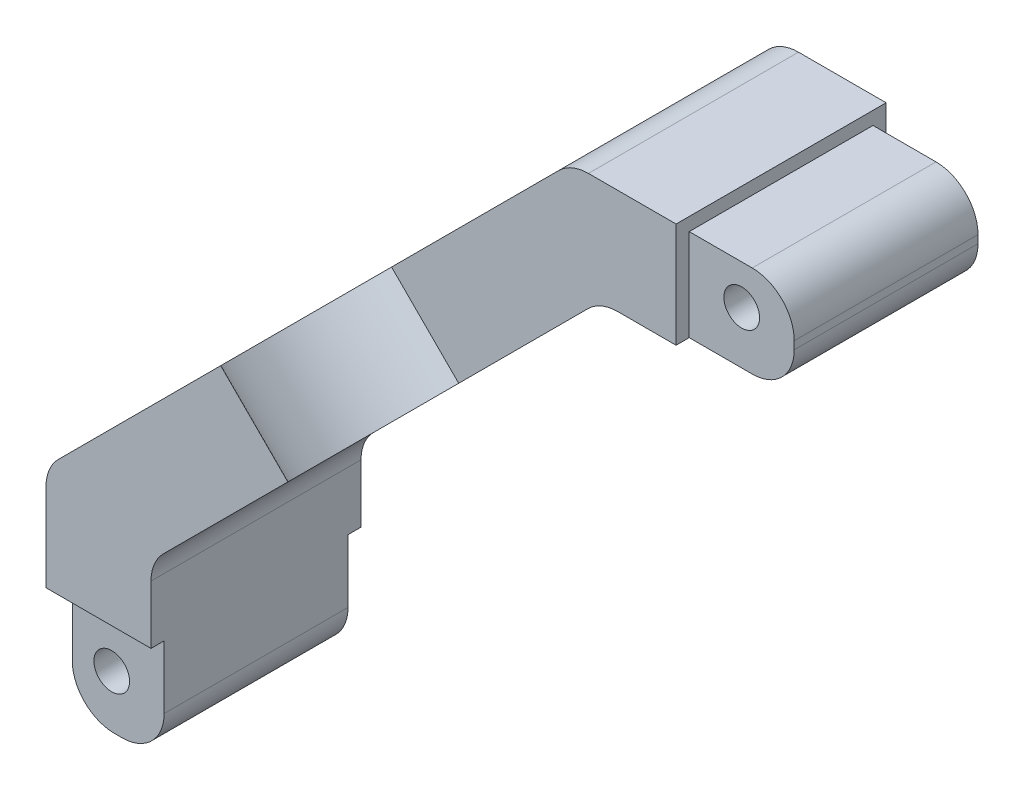
ISO-10303-21;
HEADER;
FILE_DESCRIPTION(('STEP AP214'),'2;1');
FILE_NAME('part.step','',(''),(''),'','','');
FILE_SCHEMA(('AUTOMOTIVE_DESIGN { 1 0 10303 214 1 1 1 1 }'));
ENDSEC;
DATA;
#1=APPLICATION_CONTEXT('core data for automotive mechanical design processes');
#2=APPLICATION_PROTOCOL_DEFINITION('international standard','automotive_design',2000,#1);
#3=PRODUCT_CONTEXT('',#1,'mechanical');
#4=PRODUCT('Part','Part','',(#3));
#5=PRODUCT_RELATED_PRODUCT_CATEGORY('part','',(#4));
#6=PRODUCT_DEFINITION_FORMATION('','',#4);
#7=PRODUCT_DEFINITION_CONTEXT('part definition',#1,'design');
#8=PRODUCT_DEFINITION('design','',#6,#7);
#9=PRODUCT_DEFINITION_SHAPE('','',#8);
#10=(LENGTH_UNIT() NAMED_UNIT(*) SI_UNIT(.MILLI.,.METRE.));
#11=(NAMED_UNIT(*) PLANE_ANGLE_UNIT() SI_UNIT($,.RADIAN.));
#12=(NAMED_UNIT(*) SI_UNIT($,.STERADIAN.) SOLID_ANGLE_UNIT());
#13=UNCERTAINTY_MEASURE_WITH_UNIT(LENGTH_MEASURE(1.E-05),#10,'distance_accuracy_value','');
#14=(GEOMETRIC_REPRESENTATION_CONTEXT(3) GLOBAL_UNCERTAINTY_ASSIGNED_CONTEXT((#13)) GLOBAL_UNIT_ASSIGNED_CONTEXT((#10,
#11,#12)) REPRESENTATION_CONTEXT('',''));
#15=CARTESIAN_POINT('',(0.,0.,0.));
#16=DIRECTION('',(0.,0.,1.));
#17=DIRECTION('',(1.,0.,0.));
#18=AXIS2_PLACEMENT_3D('',#15,#16,#17);
#19=CARTESIAN_POINT('',(39.8696158183963,-39.8696158183966,12.7));
#20=DIRECTION('',(-0.707106781186551,0.707106781186544,0.));
#21=DIRECTION('',(-0.707106781186544,-0.707106781186551,0.));
#22=AXIS2_PLACEMENT_3D('',#19,#20,#21);
#23=CYLINDRICAL_SURFACE('',#22,11.1125);
#24=CARTESIAN_POINT('',(39.1511953287108,-39.151195328711,12.7));
#25=DIRECTION('',(0.707106781186551,-0.707106781186544,0.));
#26=DIRECTION('',(0.707106781186544,0.707106781186551,0.));
#27=AXIS2_PLACEMENT_3D('',#24,#25,#26);
#28=CIRCLE('',#27,11.1125);
#29=CARTESIAN_POINT('',(47.0089194346463,-31.2934712227755,12.7));
#30=VERTEX_POINT('',#29);
#31=EDGE_CURVE('E12',#30,#30,#28,.T.);
#32=ORIENTED_EDGE('',*,*,#31,.T.);
#33=EDGE_LOOP('',(#32));
#34=FACE_BOUND('',#33,.T.);
#35=CARTESIAN_POINT('',(34.4440768363206,-34.4440768363209,12.7));
#36=DIRECTION('',(-0.707106781186548,0.707106781186547,0.));
#37=DIRECTION('',(-0.707106781186547,-0.707106781186548,0.));
#38=AXIS2_PLACEMENT_3D('',#35,#36,#37);
#39=CIRCLE('',#38,11.1125);
#40=CARTESIAN_POINT('',(26.5863527303851,-42.3018009422564,12.7));
#41=VERTEX_POINT('',#40);
#42=EDGE_CURVE('E438',#41,#41,#39,.F.);
#43=ORIENTED_EDGE('',*,*,#42,.F.);
#44=EDGE_LOOP('',(#43));
#45=FACE_BOUND('',#44,.T.);
#46=ADVANCED_FACE('F41',(#34,#45),#23,.F.);
#47=CARTESIAN_POINT('',(0.,0.,0.));
#48=DIRECTION('',(0.,0.,1.));
#49=DIRECTION('',(1.,0.,0.));
#50=AXIS2_PLACEMENT_3D('',#47,#48,#49);
#51=PLANE('',#50);
#52=DIRECTION('',(0.707106781186547,0.707106781186548,0.));
#53=VECTOR('',#52,1.);
#54=CARTESIAN_POINT('',(31.75,-31.75,0.));
#55=LINE('',#54,#53);
#56=CARTESIAN_POINT('',(41.7902315710345,-21.7097684289655,0.));
#57=VERTEX_POINT('',#56);
#58=CARTESIAN_POINT('',(62.0121024484277,-1.48789755157233,0.));
#59=VERTEX_POINT('',#58);
#60=EDGE_CURVE('E377',#57,#59,#55,.T.);
#61=ORIENTED_EDGE('',*,*,#60,.T.);
#62=CARTESIAN_POINT('',(65.6042048968553,-5.08,0.));
#63=DIRECTION('',(0.,0.,1.));
#64=DIRECTION('',(1.,0.,0.));
#65=AXIS2_PLACEMENT_3D('',#62,#63,#64);
#66=CIRCLE('',#65,5.08);
#67=CARTESIAN_POINT('',(65.6042048968553,0.,0.));
#68=VERTEX_POINT('',#67);
#69=EDGE_CURVE('E501',#59,#68,#66,.F.);
#70=ORIENTED_EDGE('',*,*,#69,.T.);
#71=DIRECTION('',(1.,0.,0.));
#72=VECTOR('',#71,1.);
#73=CARTESIAN_POINT('',(0.,0.,0.));
#74=LINE('',#73,#72);
#75=CARTESIAN_POINT('',(76.2,0.,0.));
#76=VERTEX_POINT('',#75);
#77=EDGE_CURVE('E428',#68,#76,#74,.T.);
#78=ORIENTED_EDGE('',*,*,#77,.T.);
#79=DIRECTION('',(0.,-1.,0.));
#80=VECTOR('',#79,1.);
#81=CARTESIAN_POINT('',(76.2,0.,0.));
#82=LINE('',#81,#80);
#83=CARTESIAN_POINT('',(76.2,-12.7,0.));
#84=VERTEX_POINT('',#83);
#85=EDGE_CURVE('E363',#76,#84,#82,.T.);
#86=ORIENTED_EDGE('',*,*,#85,.T.);
#87=DIRECTION('',(1.,0.,0.));
#88=VECTOR('',#87,1.);
#89=CARTESIAN_POINT('',(0.,-12.7,0.));
#90=LINE('',#89,#88);
#91=CARTESIAN_POINT('',(69.143436533648,-12.7,0.));
#92=VERTEX_POINT('',#91);
#93=EDGE_CURVE('E425',#92,#84,#90,.T.);
#94=ORIENTED_EDGE('',*,*,#93,.F.);
#95=CARTESIAN_POINT('',(69.143436533648,-17.78,0.));
#96=DIRECTION('',(0.,0.,1.));
#97=DIRECTION('',(1.,0.,0.));
#98=AXIS2_PLACEMENT_3D('',#95,#96,#97);
#99=CIRCLE('',#98,5.08);
#100=CARTESIAN_POINT('',(65.5513340852203,-14.1878975515724,0.));
#101=VERTEX_POINT('',#100);
#102=EDGE_CURVE('E531',#92,#101,#99,.T.);
#103=ORIENTED_EDGE('',*,*,#102,.T.);
#104=DIRECTION('',(-0.707106781186544,-0.707106781186551,0.));
#105=VECTOR('',#104,1.);
#106=CARTESIAN_POINT('',(39.8696158183966,-39.8696158183963,0.));
#107=LINE('',#106,#105);
#108=CARTESIAN_POINT('',(49.9098473894309,-29.8293842473619,0.));
#109=VERTEX_POINT('',#108);
#110=EDGE_CURVE('E422',#101,#109,#107,.T.);
#111=ORIENTED_EDGE('',*,*,#110,.T.);
#112=DIRECTION('',(-0.707106781186548,0.707106781186547,0.));
#113=VECTOR('',#112,1.);
#114=CARTESIAN_POINT('',(49.9098473894309,-29.829384247362,0.));
#115=LINE('',#114,#113);
#116=EDGE_CURVE('E277',#109,#57,#115,.T.);
#117=ORIENTED_EDGE('',*,*,#116,.T.);
#118=EDGE_LOOP('',(#61,#70,#78,#86,#94,#103,#111,#117));
#119=FACE_BOUND('',#118,.T.);
#120=ADVANCED_FACE('F556',(#119),#51,.F.);
#121=CARTESIAN_POINT('',(0.,0.,25.4));
#122=DIRECTION('',(0.,0.,1.));
#123=DIRECTION('',(1.,0.,0.));
#124=AXIS2_PLACEMENT_3D('',#121,#122,#123);
#125=PLANE('',#124);
#126=DIRECTION('',(1.,0.,0.));
#127=VECTOR('',#126,1.);
#128=CARTESIAN_POINT('',(0.,0.,25.4));
#129=LINE('',#128,#127);
#130=CARTESIAN_POINT('',(65.6042048968553,0.,25.4));
#131=VERTEX_POINT('',#130);
#132=CARTESIAN_POINT('',(76.2,0.,25.4));
#133=VERTEX_POINT('',#132);
#134=EDGE_CURVE('E408',#131,#133,#129,.T.);
#135=ORIENTED_EDGE('',*,*,#134,.F.);
#136=CARTESIAN_POINT('',(65.6042048968553,-5.08,25.4));
#137=DIRECTION('',(0.,0.,1.));
#138=DIRECTION('',(1.,0.,0.));
#139=AXIS2_PLACEMENT_3D('',#136,#137,#138);
#140=CIRCLE('',#139,5.08);
#141=CARTESIAN_POINT('',(62.0121024484277,-1.48789755157233,25.4));
#142=VERTEX_POINT('',#141);
#143=EDGE_CURVE('E507',#131,#142,#140,.T.);
#144=ORIENTED_EDGE('',*,*,#143,.T.);
#145=DIRECTION('',(0.707106781186547,0.707106781186548,0.));
#146=VECTOR('',#145,1.);
#147=CARTESIAN_POINT('',(31.75,-31.75,25.4));
#148=LINE('',#147,#146);
#149=CARTESIAN_POINT('',(41.7902315710345,-21.7097684289655,25.4));
#150=VERTEX_POINT('',#149);
#151=EDGE_CURVE('E399',#150,#142,#148,.T.);
#152=ORIENTED_EDGE('',*,*,#151,.F.);
#153=DIRECTION('',(-0.707106781186548,0.707106781186547,0.));
#154=VECTOR('',#153,1.);
#155=CARTESIAN_POINT('',(49.9098473894309,-29.829384247362,25.4));
#156=LINE('',#155,#154);
#157=CARTESIAN_POINT('',(49.9098473894309,-29.8293842473619,25.4));
#158=VERTEX_POINT('',#157);
#159=EDGE_CURVE('E253',#158,#150,#156,.T.);
#160=ORIENTED_EDGE('',*,*,#159,.F.);
#161=DIRECTION('',(-0.707106781186544,-0.707106781186551,0.));
#162=VECTOR('',#161,1.);
#163=CARTESIAN_POINT('',(39.8696158183966,-39.8696158183963,25.4));
#164=LINE('',#163,#162);
#165=CARTESIAN_POINT('',(65.5513340852203,-14.1878975515724,25.4));
#166=VERTEX_POINT('',#165);
#167=EDGE_CURVE('E242',#166,#158,#164,.T.);
#168=ORIENTED_EDGE('',*,*,#167,.F.);
#169=CARTESIAN_POINT('',(69.143436533648,-17.78,25.4));
#170=DIRECTION('',(0.,0.,1.));
#171=DIRECTION('',(1.,0.,0.));
#172=AXIS2_PLACEMENT_3D('',#169,#170,#171);
#173=CIRCLE('',#172,5.08);
#174=CARTESIAN_POINT('',(69.143436533648,-12.7,25.4));
#175=VERTEX_POINT('',#174);
#176=EDGE_CURVE('E534',#166,#175,#173,.F.);
#177=ORIENTED_EDGE('',*,*,#176,.T.);
#178=DIRECTION('',(1.,0.,0.));
#179=VECTOR('',#178,1.);
#180=CARTESIAN_POINT('',(0.,-12.7,25.4));
#181=LINE('',#180,#179);
#182=CARTESIAN_POINT('',(76.2,-12.7,25.4));
#183=VERTEX_POINT('',#182);
#184=EDGE_CURVE('E405',#175,#183,#181,.T.);
#185=ORIENTED_EDGE('',*,*,#184,.T.);
#186=DIRECTION('',(0.,-1.,0.));
#187=VECTOR('',#186,1.);
#188=CARTESIAN_POINT('',(76.2,0.,25.4));
#189=LINE('',#188,#187);
#190=EDGE_CURVE('E368',#133,#183,#189,.T.);
#191=ORIENTED_EDGE('',*,*,#190,.F.);
#192=EDGE_LOOP('',(#135,#144,#152,#160,#168,#177,#185,#191));
#193=FACE_BOUND('',#192,.T.);
#194=ADVANCED_FACE('F564',(#193),#125,.T.);
#195=DIRECTION('',(0.,-1.,0.));
#196=VECTOR('',#195,1.);
#197=CARTESIAN_POINT('',(0.,0.,0.));
#198=LINE('',#197,#196);
#199=CARTESIAN_POINT('',(0.,-65.6042048968553,0.));
#200=VERTEX_POINT('',#199);
#201=CARTESIAN_POINT('',(0.,-76.2,0.));
#202=VERTEX_POINT('',#201);
#203=EDGE_CURVE('E415',#200,#202,#198,.T.);
#204=ORIENTED_EDGE('',*,*,#203,.F.);
#205=CARTESIAN_POINT('',(5.08000000000001,-65.6042048968553,0.));
#206=DIRECTION('',(0.,0.,1.));
#207=DIRECTION('',(1.,0.,0.));
#208=AXIS2_PLACEMENT_3D('',#205,#206,#207);
#209=CIRCLE('',#208,5.08);
#210=CARTESIAN_POINT('',(1.48789755157234,-62.0121024484277,0.));
#211=VERTEX_POINT('',#210);
#212=EDGE_CURVE('E488',#200,#211,#209,.F.);
#213=ORIENTED_EDGE('',*,*,#212,.T.);
#214=CARTESIAN_POINT('',(21.7097684289653,-41.7902315710347,0.));
#215=VERTEX_POINT('',#214);
#216=EDGE_CURVE('E412',#211,#215,#55,.T.);
#217=ORIENTED_EDGE('',*,*,#216,.T.);
#218=DIRECTION('',(-0.707106781186548,0.707106781186547,0.));
#219=VECTOR('',#218,1.);
#220=CARTESIAN_POINT('',(29.8293842473617,-49.9098473894312,0.));
#221=LINE('',#220,#219);
#222=CARTESIAN_POINT('',(29.8293842473618,-49.9098473894312,0.));
#223=VERTEX_POINT('',#222);
#224=EDGE_CURVE('E273',#215,#223,#221,.F.);
#225=ORIENTED_EDGE('',*,*,#224,.T.);
#226=CARTESIAN_POINT('',(14.1878975515723,-65.5513340852208,0.));
#227=VERTEX_POINT('',#226);
#228=EDGE_CURVE('E421',#223,#227,#107,.T.);
#229=ORIENTED_EDGE('',*,*,#228,.T.);
#230=CARTESIAN_POINT('',(17.78,-69.1434365336484,0.));
#231=DIRECTION('',(0.,0.,1.));
#232=DIRECTION('',(1.,0.,0.));
#233=AXIS2_PLACEMENT_3D('',#230,#231,#232);
#234=CIRCLE('',#233,5.08);
#235=CARTESIAN_POINT('',(12.7,-69.1434365336484,0.));
#236=VERTEX_POINT('',#235);
#237=EDGE_CURVE('E537',#227,#236,#234,.T.);
#238=ORIENTED_EDGE('',*,*,#237,.T.);
#239=DIRECTION('',(0.,-1.,0.));
#240=VECTOR('',#239,1.);
#241=CARTESIAN_POINT('',(12.7,0.,0.));
#242=LINE('',#241,#240);
#243=CARTESIAN_POINT('',(12.7,-76.2,0.));
#244=VERTEX_POINT('',#243);
#245=EDGE_CURVE('E418',#236,#244,#242,.T.);
#246=ORIENTED_EDGE('',*,*,#245,.T.);
#247=DIRECTION('',(-1.,0.,0.));
#248=VECTOR('',#247,1.);
#249=CARTESIAN_POINT('',(0.,-76.2,0.));
#250=LINE('',#249,#248);
#251=EDGE_CURVE('E381',#244,#202,#250,.T.);
#252=ORIENTED_EDGE('',*,*,#251,.T.);
#253=EDGE_LOOP('',(#204,#213,#217,#225,#229,#238,#246,#252));
#254=FACE_BOUND('',#253,.T.);
#255=ADVANCED_FACE('F567',(#254),#51,.F.);
#256=CARTESIAN_POINT('',(31.75,-31.75,25.4));
#257=DIRECTION('',(-0.707106781186548,0.707106781186547,0.));
#258=DIRECTION('',(-0.707106781186547,-0.707106781186548,0.));
#259=AXIS2_PLACEMENT_3D('',#256,#257,#258);
#260=PLANE('',#259);
#261=ORIENTED_EDGE('',*,*,#216,.F.);
#262=DIRECTION('',(0.,0.,-1.));
#263=VECTOR('',#262,1.);
#264=CARTESIAN_POINT('',(1.48789755157234,-62.0121024484277,25.4));
#265=LINE('',#264,#263);
#266=CARTESIAN_POINT('',(1.48789755157234,-62.0121024484277,25.4));
#267=VERTEX_POINT('',#266);
#268=EDGE_CURVE('E495',#211,#267,#265,.F.);
#269=ORIENTED_EDGE('',*,*,#268,.T.);
#270=CARTESIAN_POINT('',(21.7097684289653,-41.7902315710347,25.4));
#271=VERTEX_POINT('',#270);
#272=EDGE_CURVE('E395',#267,#271,#148,.T.);
#273=ORIENTED_EDGE('',*,*,#272,.T.);
#274=CARTESIAN_POINT('',(31.7499999999999,-31.7500000000001,12.7));
#275=DIRECTION('',(-0.707106781186548,0.707106781186547,0.));
#276=DIRECTION('',(-0.707106781186547,-0.707106781186548,0.));
#277=AXIS2_PLACEMENT_3D('',#274,#275,#276);
#278=CIRCLE('',#277,19.05);
#279=EDGE_CURVE('E251',#150,#271,#278,.F.);
#280=ORIENTED_EDGE('',*,*,#279,.F.);
#281=ORIENTED_EDGE('',*,*,#151,.T.);
#282=DIRECTION('',(0.,0.,-1.));
#283=VECTOR('',#282,1.);
#284=CARTESIAN_POINT('',(62.0121024484277,-1.48789755157233,25.4));
#285=LINE('',#284,#283);
#286=EDGE_CURVE('E491',#142,#59,#285,.T.);
#287=ORIENTED_EDGE('',*,*,#286,.T.);
#288=ORIENTED_EDGE('',*,*,#60,.F.);
#289=EDGE_CURVE('E265',#215,#57,#278,.F.);
#290=ORIENTED_EDGE('',*,*,#289,.F.);
#291=EDGE_LOOP('',(#261,#269,#273,#280,#281,#287,#288,#290));
#292=FACE_BOUND('',#291,.T.);
#293=CARTESIAN_POINT('',(31.7499999999998,-31.7500000000002,12.7));
#294=DIRECTION('',(-0.707106781186548,0.707106781186547,0.));
#295=DIRECTION('',(-0.707106781186547,-0.707106781186548,0.));
#296=AXIS2_PLACEMENT_3D('',#293,#294,#295);
#297=CIRCLE('',#296,4.572);
#298=CARTESIAN_POINT('',(28.5171077964149,-34.982892203585,12.7));
#299=VERTEX_POINT('',#298);
#300=EDGE_CURVE('E269',#299,#299,#297,.T.);
#301=ORIENTED_EDGE('',*,*,#300,.F.);
#302=EDGE_LOOP('',(#301));
#303=FACE_BOUND('',#302,.T.);
#304=ADVANCED_FACE('F618',(#292,#303),#260,.T.);
#305=CARTESIAN_POINT('',(0.,0.,25.4));
#306=DIRECTION('',(1.,0.,0.));
#307=DIRECTION('',(0.,1.,0.));
#308=AXIS2_PLACEMENT_3D('',#305,#306,#307);
#309=PLANE('',#308);
#310=DIRECTION('',(0.,-1.,0.));
#311=VECTOR('',#310,1.);
#312=CARTESIAN_POINT('',(0.,0.,25.4));
#313=LINE('',#312,#311);
#314=CARTESIAN_POINT('',(0.,-65.6042048968553,25.4));
#315=VERTEX_POINT('',#314);
#316=CARTESIAN_POINT('',(0.,-76.2,25.4));
#317=VERTEX_POINT('',#316);
#318=EDGE_CURVE('E398',#315,#317,#313,.T.);
#319=ORIENTED_EDGE('',*,*,#318,.F.);
#320=DIRECTION('',(0.,0.,-1.));
#321=VECTOR('',#320,1.);
#322=CARTESIAN_POINT('',(0.,-65.6042048968553,0.));
#323=LINE('',#322,#321);
#324=EDGE_CURVE('E484',#315,#200,#323,.T.);
#325=ORIENTED_EDGE('',*,*,#324,.T.);
#326=ORIENTED_EDGE('',*,*,#203,.T.);
#327=DIRECTION('',(0.,0.,1.));
#328=VECTOR('',#327,1.);
#329=CARTESIAN_POINT('',(0.,-76.2,0.));
#330=LINE('',#329,#328);
#331=EDGE_CURVE('E372',#202,#317,#330,.T.);
#332=ORIENTED_EDGE('',*,*,#331,.T.);
#333=EDGE_LOOP('',(#319,#325,#326,#332));
#334=FACE_BOUND('',#333,.T.);
#335=ADVANCED_FACE('F639',(#334),#309,.F.);
#336=CARTESIAN_POINT('',(0.,-88.9,25.4));
#337=DIRECTION('',(0.,1.,0.));
#338=DIRECTION('',(-1.,0.,0.));
#339=AXIS2_PLACEMENT_3D('',#336,#337,#338);
#340=PLANE('',#339);
#341=DIRECTION('',(-1.,0.,0.));
#342=VECTOR('',#341,1.);
#343=CARTESIAN_POINT('',(12.7,-88.9,1.5748));
#344=LINE('',#343,#342);
#345=CARTESIAN_POINT('',(7.62000000000001,-88.9,1.5748));
#346=VERTEX_POINT('',#345);
#347=CARTESIAN_POINT('',(6.66750000000001,-88.9,1.5748));
#348=VERTEX_POINT('',#347);
#349=EDGE_CURVE('E324',#346,#348,#344,.T.);
#350=ORIENTED_EDGE('',*,*,#349,.F.);
#351=DIRECTION('',(0.,0.,-1.));
#352=VECTOR('',#351,1.);
#353=CARTESIAN_POINT('',(7.62000000000001,-88.9,23.8125));
#354=LINE('',#353,#352);
#355=CARTESIAN_POINT('',(7.62000000000001,-88.9,23.8125));
#356=VERTEX_POINT('',#355);
#357=EDGE_CURVE('E471',#346,#356,#354,.F.);
#358=ORIENTED_EDGE('',*,*,#357,.T.);
#359=DIRECTION('',(1.,0.,0.));
#360=VECTOR('',#359,1.);
#361=CARTESIAN_POINT('',(12.7,-88.9,23.8125));
#362=LINE('',#361,#360);
#363=CARTESIAN_POINT('',(6.66750000000001,-88.9,23.8125));
#364=VERTEX_POINT('',#363);
#365=EDGE_CURVE('E330',#364,#356,#362,.T.);
#366=ORIENTED_EDGE('',*,*,#365,.F.);
#367=DIRECTION('',(0.,0.,1.));
#368=VECTOR('',#367,1.);
#369=CARTESIAN_POINT('',(6.66750000000001,-88.9,25.4));
#370=LINE('',#369,#368);
#371=EDGE_CURVE('E468',#364,#348,#370,.F.);
#372=ORIENTED_EDGE('',*,*,#371,.T.);
#373=EDGE_LOOP('',(#350,#358,#366,#372));
#374=FACE_BOUND('',#373,.T.);
#375=ADVANCED_FACE('F635',(#374),#340,.F.);
#376=CARTESIAN_POINT('',(12.7,0.,25.4));
#377=DIRECTION('',(1.,0.,0.));
#378=DIRECTION('',(0.,1.,0.));
#379=AXIS2_PLACEMENT_3D('',#376,#377,#378);
#380=PLANE('',#379);
#381=ORIENTED_EDGE('',*,*,#245,.F.);
#382=DIRECTION('',(0.,0.,-1.));
#383=VECTOR('',#382,1.);
#384=CARTESIAN_POINT('',(12.7,-69.1434365336484,25.4));
#385=LINE('',#384,#383);
#386=CARTESIAN_POINT('',(12.7,-69.1434365336484,25.4));
#387=VERTEX_POINT('',#386);
#388=EDGE_CURVE('E459',#236,#387,#385,.F.);
#389=ORIENTED_EDGE('',*,*,#388,.T.);
#390=DIRECTION('',(0.,-1.,0.));
#391=VECTOR('',#390,1.);
#392=CARTESIAN_POINT('',(12.7,0.,25.4));
#393=LINE('',#392,#391);
#394=CARTESIAN_POINT('',(12.7,-76.2,25.4));
#395=VERTEX_POINT('',#394);
#396=EDGE_CURVE('E243',#387,#395,#393,.T.);
#397=ORIENTED_EDGE('',*,*,#396,.T.);
#398=DIRECTION('',(0.,0.,1.));
#399=VECTOR('',#398,1.);
#400=CARTESIAN_POINT('',(12.7,-76.2,25.4));
#401=LINE('',#400,#399);
#402=CARTESIAN_POINT('',(12.7,-76.2,23.8125));
#403=VERTEX_POINT('',#402);
#404=EDGE_CURVE('E325',#403,#395,#401,.T.);
#405=ORIENTED_EDGE('',*,*,#404,.F.);
#406=DIRECTION('',(0.,-1.,0.));
#407=VECTOR('',#406,1.);
#408=CARTESIAN_POINT('',(12.7,-76.2,23.8125));
#409=LINE('',#408,#407);
#410=CARTESIAN_POINT('',(12.7,-83.82,23.8125));
#411=VERTEX_POINT('',#410);
#412=EDGE_CURVE('E333',#403,#411,#409,.T.);
#413=ORIENTED_EDGE('',*,*,#412,.T.);
#414=DIRECTION('',(0.,0.,-1.));
#415=VECTOR('',#414,1.);
#416=CARTESIAN_POINT('',(12.7,-83.82,1.5748));
#417=LINE('',#416,#415);
#418=CARTESIAN_POINT('',(12.7,-83.82,1.5748));
#419=VERTEX_POINT('',#418);
#420=EDGE_CURVE('E455',#411,#419,#417,.T.);
#421=ORIENTED_EDGE('',*,*,#420,.T.);
#422=DIRECTION('',(0.,-1.,0.));
#423=VECTOR('',#422,1.);
#424=CARTESIAN_POINT('',(12.7,-76.2,1.5748));
#425=LINE('',#424,#423);
#426=CARTESIAN_POINT('',(12.7,-76.2,1.5748));
#427=VERTEX_POINT('',#426);
#428=EDGE_CURVE('E337',#427,#419,#425,.T.);
#429=ORIENTED_EDGE('',*,*,#428,.F.);
#430=DIRECTION('',(0.,0.,1.));
#431=VECTOR('',#430,1.);
#432=CARTESIAN_POINT('',(12.7,-76.2,0.));
#433=LINE('',#432,#431);
#434=EDGE_CURVE('E342',#244,#427,#433,.T.);
#435=ORIENTED_EDGE('',*,*,#434,.F.);
#436=EDGE_LOOP('',(#381,#389,#397,#405,#413,#421,#429,#435));
#437=FACE_BOUND('',#436,.T.);
#438=ADVANCED_FACE('F632',(#437),#380,.T.);
#439=CARTESIAN_POINT('',(39.8696158183966,-39.8696158183963,25.4));
#440=DIRECTION('',(0.707106781186551,-0.707106781186544,0.));
#441=DIRECTION('',(0.707106781186544,0.707106781186551,0.));
#442=AXIS2_PLACEMENT_3D('',#439,#440,#441);
#443=PLANE('',#442);
#444=CARTESIAN_POINT('',(39.8696158183963,-39.8696158183966,12.7));
#445=DIRECTION('',(0.707106781186551,-0.707106781186544,0.));
#446=DIRECTION('',(0.707106781186544,0.707106781186551,0.));
#447=AXIS2_PLACEMENT_3D('',#444,#445,#446);
#448=CIRCLE('',#447,12.1285);
#449=CARTESIAN_POINT('',(48.4457604140173,-31.2934712227755,12.7));
#450=VERTEX_POINT('',#449);
#451=EDGE_CURVE('E50',#450,#450,#448,.F.);
#452=ORIENTED_EDGE('',*,*,#451,.T.);
#453=EDGE_LOOP('',(#452));
#454=FACE_BOUND('',#453,.T.);
#455=ORIENTED_EDGE('',*,*,#110,.F.);
#456=DIRECTION('',(0.,0.,-1.));
#457=VECTOR('',#456,1.);
#458=CARTESIAN_POINT('',(65.5513340852203,-14.1878975515724,25.4));
#459=LINE('',#458,#457);
#460=EDGE_CURVE('E452',#101,#166,#459,.F.);
#461=ORIENTED_EDGE('',*,*,#460,.T.);
#462=ORIENTED_EDGE('',*,*,#167,.T.);
#463=CARTESIAN_POINT('',(39.8696158183963,-39.8696158183966,12.7));
#464=DIRECTION('',(-0.707106781186551,0.707106781186544,0.));
#465=DIRECTION('',(-0.707106781186544,-0.707106781186551,0.));
#466=AXIS2_PLACEMENT_3D('',#463,#464,#465);
#467=CIRCLE('',#466,19.05);
#468=CARTESIAN_POINT('',(29.8293842473618,-49.9098473894312,25.4));
#469=VERTEX_POINT('',#468);
#470=EDGE_CURVE('E249',#469,#158,#467,.T.);
#471=ORIENTED_EDGE('',*,*,#470,.F.);
#472=CARTESIAN_POINT('',(14.1878975515723,-65.5513340852208,25.4));
#473=VERTEX_POINT('',#472);
#474=EDGE_CURVE('E228',#469,#473,#164,.T.);
#475=ORIENTED_EDGE('',*,*,#474,.T.);
#476=DIRECTION('',(0.,0.,-1.));
#477=VECTOR('',#476,1.);
#478=CARTESIAN_POINT('',(14.1878975515723,-65.5513340852208,0.));
#479=LINE('',#478,#477);
#480=EDGE_CURVE('E449',#473,#227,#479,.T.);
#481=ORIENTED_EDGE('',*,*,#480,.T.);
#482=ORIENTED_EDGE('',*,*,#228,.F.);
#483=EDGE_CURVE('E261',#109,#223,#467,.T.);
#484=ORIENTED_EDGE('',*,*,#483,.F.);
#485=EDGE_LOOP('',(#455,#461,#462,#471,#475,#481,#482,#484));
#486=FACE_BOUND('',#485,.T.);
#487=ADVANCED_FACE('F257',(#454,#486),#443,.T.);
#488=CARTESIAN_POINT('',(0.,-12.7,25.4));
#489=DIRECTION('',(0.,1.,0.));
#490=DIRECTION('',(0.,0.,1.));
#491=AXIS2_PLACEMENT_3D('',#488,#489,#490);
#492=PLANE('',#491);
#493=ORIENTED_EDGE('',*,*,#184,.F.);
#494=DIRECTION('',(0.,0.,-1.));
#495=VECTOR('',#494,1.);
#496=CARTESIAN_POINT('',(69.143436533648,-12.7,25.4));
#497=LINE('',#496,#495);
#498=EDGE_CURVE('E445',#175,#92,#497,.T.);
#499=ORIENTED_EDGE('',*,*,#498,.T.);
#500=ORIENTED_EDGE('',*,*,#93,.T.);
#501=DIRECTION('',(0.,0.,-1.));
#502=VECTOR('',#501,1.);
#503=CARTESIAN_POINT('',(76.2,-12.7,0.));
#504=LINE('',#503,#502);
#505=CARTESIAN_POINT('',(76.2,-12.7,1.5875));
#506=VERTEX_POINT('',#505);
#507=EDGE_CURVE('E285',#506,#84,#504,.T.);
#508=ORIENTED_EDGE('',*,*,#507,.F.);
#509=DIRECTION('',(1.,0.,0.));
#510=VECTOR('',#509,1.);
#511=CARTESIAN_POINT('',(76.2,-12.7,1.5875));
#512=LINE('',#511,#510);
#513=CARTESIAN_POINT('',(83.82,-12.7,1.5875));
#514=VERTEX_POINT('',#513);
#515=EDGE_CURVE('E290',#506,#514,#512,.T.);
#516=ORIENTED_EDGE('',*,*,#515,.T.);
#517=DIRECTION('',(0.,0.,-1.));
#518=VECTOR('',#517,1.);
#519=CARTESIAN_POINT('',(83.82,-12.7,23.8125));
#520=LINE('',#519,#518);
#521=CARTESIAN_POINT('',(83.82,-12.7,23.8125));
#522=VERTEX_POINT('',#521);
#523=EDGE_CURVE('E442',#514,#522,#520,.F.);
#524=ORIENTED_EDGE('',*,*,#523,.T.);
#525=DIRECTION('',(1.,0.,0.));
#526=VECTOR('',#525,1.);
#527=CARTESIAN_POINT('',(76.2,-12.7,23.8125));
#528=LINE('',#527,#526);
#529=CARTESIAN_POINT('',(76.2,-12.7,23.8125));
#530=VERTEX_POINT('',#529);
#531=EDGE_CURVE('E294',#530,#522,#528,.T.);
#532=ORIENTED_EDGE('',*,*,#531,.F.);
#533=DIRECTION('',(0.,0.,-1.));
#534=VECTOR('',#533,1.);
#535=CARTESIAN_POINT('',(76.2,-12.7,25.4));
#536=LINE('',#535,#534);
#537=EDGE_CURVE('E299',#183,#530,#536,.T.);
#538=ORIENTED_EDGE('',*,*,#537,.F.);
#539=EDGE_LOOP('',(#493,#499,#500,#508,#516,#524,#532,#538));
#540=FACE_BOUND('',#539,.T.);
#541=ADVANCED_FACE('F626',(#540),#492,.F.);
#542=CARTESIAN_POINT('',(88.9,0.,25.4));
#543=DIRECTION('',(1.,0.,0.));
#544=DIRECTION('',(0.,0.,-1.));
#545=AXIS2_PLACEMENT_3D('',#542,#543,#544);
#546=PLANE('',#545);
#547=DIRECTION('',(0.,1.,0.));
#548=VECTOR('',#547,1.);
#549=CARTESIAN_POINT('',(88.9,-12.7,23.8125));
#550=LINE('',#549,#548);
#551=CARTESIAN_POINT('',(88.9,-7.62,23.8125));
#552=VERTEX_POINT('',#551);
#553=CARTESIAN_POINT('',(88.9,-6.6675,23.8125));
#554=VERTEX_POINT('',#553);
#555=EDGE_CURVE('E281',#552,#554,#550,.T.);
#556=ORIENTED_EDGE('',*,*,#555,.F.);
#557=DIRECTION('',(0.,0.,-1.));
#558=VECTOR('',#557,1.);
#559=CARTESIAN_POINT('',(88.9,-7.62,1.5875));
#560=LINE('',#559,#558);
#561=CARTESIAN_POINT('',(88.9,-7.62,1.5875));
#562=VERTEX_POINT('',#561);
#563=EDGE_CURVE('E514',#552,#562,#560,.T.);
#564=ORIENTED_EDGE('',*,*,#563,.T.);
#565=DIRECTION('',(0.,-1.,0.));
#566=VECTOR('',#565,1.);
#567=CARTESIAN_POINT('',(88.9,-12.7,1.5875));
#568=LINE('',#567,#566);
#569=CARTESIAN_POINT('',(88.9,-6.6675,1.5875));
#570=VERTEX_POINT('',#569);
#571=EDGE_CURVE('E286',#570,#562,#568,.T.);
#572=ORIENTED_EDGE('',*,*,#571,.F.);
#573=DIRECTION('',(0.,0.,1.));
#574=VECTOR('',#573,1.);
#575=CARTESIAN_POINT('',(88.9,-6.6675,23.8125));
#576=LINE('',#575,#574);
#577=EDGE_CURVE('E510',#570,#554,#576,.T.);
#578=ORIENTED_EDGE('',*,*,#577,.T.);
#579=EDGE_LOOP('',(#556,#564,#572,#578));
#580=FACE_BOUND('',#579,.T.);
#581=ADVANCED_FACE('F622',(#580),#546,.T.);
#582=CARTESIAN_POINT('',(0.,0.,25.4));
#583=DIRECTION('',(0.,1.,0.));
#584=DIRECTION('',(0.,0.,1.));
#585=AXIS2_PLACEMENT_3D('',#582,#583,#584);
#586=PLANE('',#585);
#587=ORIENTED_EDGE('',*,*,#77,.F.);
#588=DIRECTION('',(0.,0.,-1.));
#589=VECTOR('',#588,1.);
#590=CARTESIAN_POINT('',(65.6042048968553,0.,25.4));
#591=LINE('',#590,#589);
#592=EDGE_CURVE('E504',#68,#131,#591,.F.);
#593=ORIENTED_EDGE('',*,*,#592,.T.);
#594=ORIENTED_EDGE('',*,*,#134,.T.);
#595=DIRECTION('',(0.,0.,1.));
#596=VECTOR('',#595,1.);
#597=CARTESIAN_POINT('',(76.2,0.,0.));
#598=LINE('',#597,#596);
#599=EDGE_CURVE('E367',#76,#133,#598,.T.);
#600=ORIENTED_EDGE('',*,*,#599,.F.);
#601=EDGE_LOOP('',(#587,#593,#594,#600));
#602=FACE_BOUND('',#601,.T.);
#603=ADVANCED_FACE('F615',(#602),#586,.T.);
#604=ORIENTED_EDGE('',*,*,#272,.F.);
#605=CARTESIAN_POINT('',(5.08000000000001,-65.6042048968553,25.4));
#606=DIRECTION('',(0.,0.,1.));
#607=DIRECTION('',(1.,0.,0.));
#608=AXIS2_PLACEMENT_3D('',#605,#606,#607);
#609=CIRCLE('',#608,5.08);
#610=EDGE_CURVE('E498',#267,#315,#609,.T.);
#611=ORIENTED_EDGE('',*,*,#610,.T.);
#612=ORIENTED_EDGE('',*,*,#318,.T.);
#613=DIRECTION('',(-1.,0.,0.));
#614=VECTOR('',#613,1.);
#615=CARTESIAN_POINT('',(0.,-76.2,25.4));
#616=LINE('',#615,#614);
#617=EDGE_CURVE('E362',#395,#317,#616,.T.);
#618=ORIENTED_EDGE('',*,*,#617,.F.);
#619=ORIENTED_EDGE('',*,*,#396,.F.);
#620=CARTESIAN_POINT('',(17.78,-69.1434365336484,25.4));
#621=DIRECTION('',(0.,0.,1.));
#622=DIRECTION('',(1.,0.,0.));
#623=AXIS2_PLACEMENT_3D('',#620,#621,#622);
#624=CIRCLE('',#623,5.08);
#625=EDGE_CURVE('E236',#387,#473,#624,.F.);
#626=ORIENTED_EDGE('',*,*,#625,.T.);
#627=ORIENTED_EDGE('',*,*,#474,.F.);
#628=DIRECTION('',(-0.707106781186548,0.707106781186547,0.));
#629=VECTOR('',#628,1.);
#630=CARTESIAN_POINT('',(29.8293842473617,-49.9098473894312,25.4));
#631=LINE('',#630,#629);
#632=EDGE_CURVE('E232',#271,#469,#631,.F.);
#633=ORIENTED_EDGE('',*,*,#632,.F.);
#634=EDGE_LOOP('',(#604,#611,#612,#618,#619,#626,#627,#633));
#635=FACE_BOUND('',#634,.T.);
#636=ADVANCED_FACE('F231',(#635),#125,.T.);
#637=CARTESIAN_POINT('',(88.9,-1.5875,0.));
#638=DIRECTION('',(0.,-1.,0.));
#639=DIRECTION('',(1.,0.,0.));
#640=AXIS2_PLACEMENT_3D('',#637,#638,#639);
#641=PLANE('',#640);
#642=DIRECTION('',(1.,0.,0.));
#643=VECTOR('',#642,1.);
#644=CARTESIAN_POINT('',(88.9,-1.5875,23.8125));
#645=LINE('',#644,#643);
#646=CARTESIAN_POINT('',(76.2,-1.5875,23.8125));
#647=VERTEX_POINT('',#646);
#648=CARTESIAN_POINT('',(83.82,-1.5875,23.8125));
#649=VERTEX_POINT('',#648);
#650=EDGE_CURVE('E298',#647,#649,#645,.T.);
#651=ORIENTED_EDGE('',*,*,#650,.T.);
#652=DIRECTION('',(0.,0.,1.));
#653=VECTOR('',#652,1.);
#654=CARTESIAN_POINT('',(83.82,-1.5875,1.5875));
#655=LINE('',#654,#653);
#656=CARTESIAN_POINT('',(83.82,-1.5875,1.5875));
#657=VERTEX_POINT('',#656);
#658=EDGE_CURVE('E64',#649,#657,#655,.F.);
#659=ORIENTED_EDGE('',*,*,#658,.T.);
#660=DIRECTION('',(-1.,0.,0.));
#661=VECTOR('',#660,1.);
#662=CARTESIAN_POINT('',(88.9,-1.5875,1.5875));
#663=LINE('',#662,#661);
#664=CARTESIAN_POINT('',(76.2,-1.5875,1.5875));
#665=VERTEX_POINT('',#664);
#666=EDGE_CURVE('E317',#657,#665,#663,.T.);
#667=ORIENTED_EDGE('',*,*,#666,.T.);
#668=DIRECTION('',(0.,0.,1.));
#669=VECTOR('',#668,1.);
#670=CARTESIAN_POINT('',(76.2,-1.5875,0.));
#671=LINE('',#670,#669);
#672=EDGE_CURVE('E373',#665,#647,#671,.T.);
#673=ORIENTED_EDGE('',*,*,#672,.T.);
#674=EDGE_LOOP('',(#651,#659,#667,#673));
#675=FACE_BOUND('',#674,.T.);
#676=ADVANCED_FACE('F597',(#675),#641,.F.);
#677=CARTESIAN_POINT('',(76.2,0.,0.));
#678=DIRECTION('',(-1.,0.,0.));
#679=DIRECTION('',(0.,0.,1.));
#680=AXIS2_PLACEMENT_3D('',#677,#678,#679);
#681=PLANE('',#680);
#682=ORIENTED_EDGE('',*,*,#672,.F.);
#683=DIRECTION('',(0.,-1.,0.));
#684=VECTOR('',#683,1.);
#685=CARTESIAN_POINT('',(76.2,-12.7,1.5875));
#686=LINE('',#685,#684);
#687=EDGE_CURVE('E282',#665,#506,#686,.T.);
#688=ORIENTED_EDGE('',*,*,#687,.T.);
#689=ORIENTED_EDGE('',*,*,#507,.T.);
#690=ORIENTED_EDGE('',*,*,#85,.F.);
#691=ORIENTED_EDGE('',*,*,#599,.T.);
#692=ORIENTED_EDGE('',*,*,#190,.T.);
#693=ORIENTED_EDGE('',*,*,#537,.T.);
#694=DIRECTION('',(0.,1.,0.));
#695=VECTOR('',#694,1.);
#696=CARTESIAN_POINT('',(76.2,-12.7,23.8125));
#697=LINE('',#696,#695);
#698=EDGE_CURVE('E303',#530,#647,#697,.T.);
#699=ORIENTED_EDGE('',*,*,#698,.T.);
#700=EDGE_LOOP('',(#682,#688,#689,#690,#691,#692,#693,#699));
#701=FACE_BOUND('',#700,.T.);
#702=ADVANCED_FACE('F600',(#701),#681,.F.);
#703=CARTESIAN_POINT('',(0.,-76.2,0.));
#704=DIRECTION('',(0.,1.,0.));
#705=DIRECTION('',(0.,0.,1.));
#706=AXIS2_PLACEMENT_3D('',#703,#704,#705);
#707=PLANE('',#706);
#708=DIRECTION('',(0.,0.,1.));
#709=VECTOR('',#708,1.);
#710=CARTESIAN_POINT('',(1.58750000000001,-76.2,0.));
#711=LINE('',#710,#709);
#712=CARTESIAN_POINT('',(1.58750000000001,-76.2,1.5748));
#713=VERTEX_POINT('',#712);
#714=CARTESIAN_POINT('',(1.58750000000001,-76.2,23.8125));
#715=VERTEX_POINT('',#714);
#716=EDGE_CURVE('E385',#713,#715,#711,.T.);
#717=ORIENTED_EDGE('',*,*,#716,.T.);
#718=DIRECTION('',(1.,0.,0.));
#719=VECTOR('',#718,1.);
#720=CARTESIAN_POINT('',(12.7,-76.2,23.8125));
#721=LINE('',#720,#719);
#722=EDGE_CURVE('E329',#715,#403,#721,.T.);
#723=ORIENTED_EDGE('',*,*,#722,.T.);
#724=ORIENTED_EDGE('',*,*,#404,.T.);
#725=ORIENTED_EDGE('',*,*,#617,.T.);
#726=ORIENTED_EDGE('',*,*,#331,.F.);
#727=ORIENTED_EDGE('',*,*,#251,.F.);
#728=ORIENTED_EDGE('',*,*,#434,.T.);
#729=DIRECTION('',(-1.,0.,0.));
#730=VECTOR('',#729,1.);
#731=CARTESIAN_POINT('',(12.7,-76.2,1.5748));
#732=LINE('',#731,#730);
#733=EDGE_CURVE('E346',#427,#713,#732,.T.);
#734=ORIENTED_EDGE('',*,*,#733,.T.);
#735=EDGE_LOOP('',(#717,#723,#724,#725,#726,#727,#728,#734));
#736=FACE_BOUND('',#735,.T.);
#737=ADVANCED_FACE('F603',(#736),#707,.F.);
#738=CARTESIAN_POINT('',(1.58750000000001,-88.9,0.));
#739=DIRECTION('',(1.,0.,0.));
#740=DIRECTION('',(0.,0.,-1.));
#741=AXIS2_PLACEMENT_3D('',#738,#739,#740);
#742=PLANE('',#741);
#743=DIRECTION('',(0.,-1.,0.));
#744=VECTOR('',#743,1.);
#745=CARTESIAN_POINT('',(1.58750000000001,-88.9,1.5748));
#746=LINE('',#745,#744);
#747=CARTESIAN_POINT('',(1.58750000000001,-83.82,1.5748));
#748=VERTEX_POINT('',#747);
#749=EDGE_CURVE('E411',#713,#748,#746,.T.);
#750=ORIENTED_EDGE('',*,*,#749,.T.);
#751=DIRECTION('',(0.,0.,1.));
#752=VECTOR('',#751,1.);
#753=CARTESIAN_POINT('',(1.58750000000001,-83.82,0.));
#754=LINE('',#753,#752);
#755=CARTESIAN_POINT('',(1.58750000000001,-83.82,23.8125));
#756=VERTEX_POINT('',#755);
#757=EDGE_CURVE('E480',#748,#756,#754,.T.);
#758=ORIENTED_EDGE('',*,*,#757,.T.);
#759=DIRECTION('',(0.,1.,0.));
#760=VECTOR('',#759,1.);
#761=CARTESIAN_POINT('',(1.58750000000001,-88.9,23.8125));
#762=LINE('',#761,#760);
#763=EDGE_CURVE('E254',#756,#715,#762,.T.);
#764=ORIENTED_EDGE('',*,*,#763,.T.);
#765=ORIENTED_EDGE('',*,*,#716,.F.);
#766=EDGE_LOOP('',(#750,#758,#764,#765));
#767=FACE_BOUND('',#766,.T.);
#768=ADVANCED_FACE('F592',(#767),#742,.F.);
#769=CARTESIAN_POINT('',(12.7,-76.2,1.5748));
#770=DIRECTION('',(0.,0.,1.));
#771=DIRECTION('',(1.,0.,0.));
#772=AXIS2_PLACEMENT_3D('',#769,#770,#771);
#773=PLANE('',#772);
#774=ORIENTED_EDGE('',*,*,#428,.T.);
#775=CARTESIAN_POINT('',(7.62000000000001,-83.82,1.5748));
#776=DIRECTION('',(0.,0.,1.));
#777=DIRECTION('',(1.,0.,0.));
#778=AXIS2_PLACEMENT_3D('',#775,#776,#777);
#779=CIRCLE('',#778,5.08);
#780=EDGE_CURVE('E465',#419,#346,#779,.F.);
#781=ORIENTED_EDGE('',*,*,#780,.T.);
#782=ORIENTED_EDGE('',*,*,#349,.T.);
#783=CARTESIAN_POINT('',(6.66750000000001,-83.82,1.5748));
#784=DIRECTION('',(0.,0.,1.));
#785=DIRECTION('',(1.,0.,0.));
#786=AXIS2_PLACEMENT_3D('',#783,#784,#785);
#787=CIRCLE('',#786,5.08);
#788=EDGE_CURVE('E462',#348,#748,#787,.F.);
#789=ORIENTED_EDGE('',*,*,#788,.T.);
#790=ORIENTED_EDGE('',*,*,#749,.F.);
#791=ORIENTED_EDGE('',*,*,#733,.F.);
#792=EDGE_LOOP('',(#774,#781,#782,#789,#790,#791));
#793=FACE_BOUND('',#792,.T.);
#794=CARTESIAN_POINT('',(6.36270000000001,-82.55,1.5748));
#795=DIRECTION('',(0.,0.,1.));
#796=DIRECTION('',(1.,0.,0.));
#797=AXIS2_PLACEMENT_3D('',#794,#795,#796);
#798=CIRCLE('',#797,2.159);
#799=CARTESIAN_POINT('',(8.52170000000001,-82.55,1.5748));
#800=VERTEX_POINT('',#799);
#801=EDGE_CURVE('E341',#800,#800,#798,.F.);
#802=ORIENTED_EDGE('',*,*,#801,.F.);
#803=EDGE_LOOP('',(#802));
#804=FACE_BOUND('',#803,.T.);
#805=ADVANCED_FACE('F588',(#793,#804),#773,.F.);
#806=CARTESIAN_POINT('',(12.7,-76.2,23.8125));
#807=DIRECTION('',(0.,0.,-1.));
#808=DIRECTION('',(-1.,0.,0.));
#809=AXIS2_PLACEMENT_3D('',#806,#807,#808);
#810=PLANE('',#809);
#811=ORIENTED_EDGE('',*,*,#365,.T.);
#812=CARTESIAN_POINT('',(7.62000000000001,-83.82,23.8125));
#813=DIRECTION('',(0.,0.,-1.));
#814=DIRECTION('',(-1.,0.,0.));
#815=AXIS2_PLACEMENT_3D('',#812,#813,#814);
#816=CIRCLE('',#815,5.08);
#817=EDGE_CURVE('E477',#356,#411,#816,.F.);
#818=ORIENTED_EDGE('',*,*,#817,.T.);
#819=ORIENTED_EDGE('',*,*,#412,.F.);
#820=ORIENTED_EDGE('',*,*,#722,.F.);
#821=ORIENTED_EDGE('',*,*,#763,.F.);
#822=CARTESIAN_POINT('',(6.66750000000001,-83.82,23.8125));
#823=DIRECTION('',(0.,0.,-1.));
#824=DIRECTION('',(-1.,0.,0.));
#825=AXIS2_PLACEMENT_3D('',#822,#823,#824);
#826=CIRCLE('',#825,5.08);
#827=EDGE_CURVE('E474',#756,#364,#826,.F.);
#828=ORIENTED_EDGE('',*,*,#827,.T.);
#829=EDGE_LOOP('',(#811,#818,#819,#820,#821,#828));
#830=FACE_BOUND('',#829,.T.);
#831=CARTESIAN_POINT('',(6.36270000000001,-82.55,23.8125));
#832=DIRECTION('',(0.,0.,-1.));
#833=DIRECTION('',(-1.,0.,0.));
#834=AXIS2_PLACEMENT_3D('',#831,#832,#833);
#835=CIRCLE('',#834,2.159);
#836=CARTESIAN_POINT('',(4.20370000000001,-82.55,23.8125));
#837=VERTEX_POINT('',#836);
#838=EDGE_CURVE('E358',#837,#837,#835,.F.);
#839=ORIENTED_EDGE('',*,*,#838,.F.);
#840=EDGE_LOOP('',(#839));
#841=FACE_BOUND('',#840,.T.);
#842=ADVANCED_FACE('F585',(#830,#841),#810,.F.);
#843=CARTESIAN_POINT('',(6.36270000000001,-82.55,0.));
#844=DIRECTION('',(0.,0.,1.));
#845=DIRECTION('',(1.,0.,0.));
#846=AXIS2_PLACEMENT_3D('',#843,#844,#845);
#847=CYLINDRICAL_SURFACE('',#846,2.159);
#848=ORIENTED_EDGE('',*,*,#838,.T.);
#849=EDGE_LOOP('',(#848));
#850=FACE_BOUND('',#849,.T.);
#851=ORIENTED_EDGE('',*,*,#801,.T.);
#852=EDGE_LOOP('',(#851));
#853=FACE_BOUND('',#852,.T.);
#854=ADVANCED_FACE('F584',(#850,#853),#847,.F.);
#855=CARTESIAN_POINT('',(76.2,-12.7,23.8125));
#856=DIRECTION('',(0.,0.,-1.));
#857=DIRECTION('',(-1.,0.,0.));
#858=AXIS2_PLACEMENT_3D('',#855,#856,#857);
#859=PLANE('',#858);
#860=ORIENTED_EDGE('',*,*,#531,.T.);
#861=CARTESIAN_POINT('',(83.82,-7.62,23.8125));
#862=DIRECTION('',(0.,0.,-1.));
#863=DIRECTION('',(-1.,0.,0.));
#864=AXIS2_PLACEMENT_3D('',#861,#862,#863);
#865=CIRCLE('',#864,5.08);
#866=EDGE_CURVE('E526',#522,#552,#865,.F.);
#867=ORIENTED_EDGE('',*,*,#866,.T.);
#868=ORIENTED_EDGE('',*,*,#555,.T.);
#869=CARTESIAN_POINT('',(83.82,-6.6675,23.8125));
#870=DIRECTION('',(0.,0.,-1.));
#871=DIRECTION('',(-1.,0.,0.));
#872=AXIS2_PLACEMENT_3D('',#869,#870,#871);
#873=CIRCLE('',#872,5.08);
#874=EDGE_CURVE('E57',#554,#649,#873,.F.);
#875=ORIENTED_EDGE('',*,*,#874,.T.);
#876=ORIENTED_EDGE('',*,*,#650,.F.);
#877=ORIENTED_EDGE('',*,*,#698,.F.);
#878=EDGE_LOOP('',(#860,#867,#868,#875,#876,#877));
#879=FACE_BOUND('',#878,.T.);
#880=CARTESIAN_POINT('',(82.55,-6.3627,23.8125));
#881=DIRECTION('',(0.,0.,-1.));
#882=DIRECTION('',(-1.,0.,0.));
#883=AXIS2_PLACEMENT_3D('',#880,#881,#882);
#884=CIRCLE('',#883,2.15899999999999);
#885=CARTESIAN_POINT('',(80.391,-6.3627,23.8125));
#886=VERTEX_POINT('',#885);
#887=EDGE_CURVE('E313',#886,#886,#884,.F.);
#888=ORIENTED_EDGE('',*,*,#887,.F.);
#889=EDGE_LOOP('',(#888));
#890=FACE_BOUND('',#889,.T.);
#891=ADVANCED_FACE('F580',(#879,#890),#859,.F.);
#892=CARTESIAN_POINT('',(76.2,-12.7,1.5875));
#893=DIRECTION('',(0.,0.,1.));
#894=DIRECTION('',(0.,-1.,0.));
#895=AXIS2_PLACEMENT_3D('',#892,#893,#894);
#896=PLANE('',#895);
#897=ORIENTED_EDGE('',*,*,#571,.T.);
#898=CARTESIAN_POINT('',(83.82,-7.62,1.5875));
#899=DIRECTION('',(0.,0.,1.));
#900=DIRECTION('',(0.,-1.,0.));
#901=AXIS2_PLACEMENT_3D('',#898,#899,#900);
#902=CIRCLE('',#901,5.08);
#903=EDGE_CURVE('E521',#562,#514,#902,.F.);
#904=ORIENTED_EDGE('',*,*,#903,.T.);
#905=ORIENTED_EDGE('',*,*,#515,.F.);
#906=ORIENTED_EDGE('',*,*,#687,.F.);
#907=ORIENTED_EDGE('',*,*,#666,.F.);
#908=CARTESIAN_POINT('',(83.82,-6.6675,1.5875));
#909=DIRECTION('',(0.,0.,1.));
#910=DIRECTION('',(0.,-1.,0.));
#911=AXIS2_PLACEMENT_3D('',#908,#909,#910);
#912=CIRCLE('',#911,5.08);
#913=EDGE_CURVE('E518',#657,#570,#912,.F.);
#914=ORIENTED_EDGE('',*,*,#913,.T.);
#915=EDGE_LOOP('',(#897,#904,#905,#906,#907,#914));
#916=FACE_BOUND('',#915,.T.);
#917=CARTESIAN_POINT('',(82.55,-6.3627,1.5875));
#918=DIRECTION('',(0.,0.,1.));
#919=DIRECTION('',(0.,-1.,0.));
#920=AXIS2_PLACEMENT_3D('',#917,#918,#919);
#921=CIRCLE('',#920,2.15899999999999);
#922=CARTESIAN_POINT('',(82.55,-8.5217,1.5875));
#923=VERTEX_POINT('',#922);
#924=EDGE_CURVE('E320',#923,#923,#921,.F.);
#925=ORIENTED_EDGE('',*,*,#924,.F.);
#926=EDGE_LOOP('',(#925));
#927=FACE_BOUND('',#926,.T.);
#928=ADVANCED_FACE('F577',(#916,#927),#896,.F.);
#929=CARTESIAN_POINT('',(82.55,-6.3627,0.));
#930=DIRECTION('',(0.,0.,1.));
#931=DIRECTION('',(1.,0.,0.));
#932=AXIS2_PLACEMENT_3D('',#929,#930,#931);
#933=CYLINDRICAL_SURFACE('',#932,2.15899999999999);
#934=ORIENTED_EDGE('',*,*,#924,.T.);
#935=EDGE_LOOP('',(#934));
#936=FACE_BOUND('',#935,.T.);
#937=ORIENTED_EDGE('',*,*,#887,.T.);
#938=EDGE_LOOP('',(#937));
#939=FACE_BOUND('',#938,.T.);
#940=ADVANCED_FACE('F576',(#936,#939),#933,.F.);
#941=CARTESIAN_POINT('',(39.8696158183963,-39.8696158183966,12.7));
#942=DIRECTION('',(-0.707106781186548,0.707106781186547,0.));
#943=DIRECTION('',(-0.707106781186547,-0.707106781186548,0.));
#944=AXIS2_PLACEMENT_3D('',#941,#942,#943);
#945=CYLINDRICAL_SURFACE('',#944,19.05);
#946=ORIENTED_EDGE('',*,*,#470,.T.);
#947=ORIENTED_EDGE('',*,*,#159,.T.);
#948=ORIENTED_EDGE('',*,*,#279,.T.);
#949=ORIENTED_EDGE('',*,*,#632,.T.);
#950=EDGE_LOOP('',(#946,#947,#948,#949));
#951=FACE_BOUND('',#950,.T.);
#952=ADVANCED_FACE('F247',(#951),#945,.T.);
#953=ORIENTED_EDGE('',*,*,#116,.F.);
#954=ORIENTED_EDGE('',*,*,#483,.T.);
#955=ORIENTED_EDGE('',*,*,#224,.F.);
#956=ORIENTED_EDGE('',*,*,#289,.T.);
#957=EDGE_LOOP('',(#953,#954,#955,#956));
#958=FACE_BOUND('',#957,.T.);
#959=ADVANCED_FACE('F575',(#958),#945,.T.);
#960=CARTESIAN_POINT('',(34.4440768363206,-34.4440768363209,12.7));
#961=DIRECTION('',(-0.707106781186548,0.707106781186547,0.));
#962=DIRECTION('',(-0.707106781186547,-0.707106781186548,0.));
#963=AXIS2_PLACEMENT_3D('',#960,#961,#962);
#964=PLANE('',#963);
#965=CARTESIAN_POINT('',(34.4440768363206,-34.4440768363209,12.7));
#966=DIRECTION('',(-0.707106781186548,0.707106781186547,0.));
#967=DIRECTION('',(-0.707106781186547,-0.707106781186548,0.));
#968=AXIS2_PLACEMENT_3D('',#965,#966,#967);
#969=CIRCLE('',#968,4.572);
#970=CARTESIAN_POINT('',(31.2111846327357,-37.6769690399058,12.7));
#971=VERTEX_POINT('',#970);
#972=EDGE_CURVE('E267',#971,#971,#969,.T.);
#973=ORIENTED_EDGE('',*,*,#972,.T.);
#974=EDGE_LOOP('',(#973));
#975=FACE_BOUND('',#974,.T.);
#976=ORIENTED_EDGE('',*,*,#42,.T.);
#977=EDGE_LOOP('',(#976));
#978=FACE_BOUND('',#977,.T.);
#979=ADVANCED_FACE('F571',(#975,#978),#964,.F.);
#980=CARTESIAN_POINT('',(34.4440768363206,-34.4440768363209,12.7));
#981=DIRECTION('',(-0.707106781186548,0.707106781186548,0.));
#982=DIRECTION('',(-0.707106781186547,-0.707106781186548,0.));
#983=AXIS2_PLACEMENT_3D('',#980,#981,#982);
#984=CYLINDRICAL_SURFACE('',#983,4.572);
#985=ORIENTED_EDGE('',*,*,#972,.F.);
#986=EDGE_LOOP('',(#985));
#987=FACE_BOUND('',#986,.T.);
#988=ORIENTED_EDGE('',*,*,#300,.T.);
#989=EDGE_LOOP('',(#988));
#990=FACE_BOUND('',#989,.T.);
#991=ADVANCED_FACE('F651',(#987,#990),#984,.F.);
#992=CARTESIAN_POINT('',(69.143436533648,-17.78,25.4));
#993=DIRECTION('',(0.,0.,-1.));
#994=DIRECTION('',(-1.,0.,0.));
#995=AXIS2_PLACEMENT_3D('',#992,#993,#994);
#996=CYLINDRICAL_SURFACE('',#995,5.08);
#997=ORIENTED_EDGE('',*,*,#176,.F.);
#998=ORIENTED_EDGE('',*,*,#460,.F.);
#999=ORIENTED_EDGE('',*,*,#102,.F.);
#1000=ORIENTED_EDGE('',*,*,#498,.F.);
#1001=EDGE_LOOP('',(#997,#998,#999,#1000));
#1002=FACE_BOUND('',#1001,.T.);
#1003=ADVANCED_FACE('F647',(#1002),#996,.F.);
#1004=CARTESIAN_POINT('',(17.78,-69.1434365336484,25.4));
#1005=DIRECTION('',(0.,0.,1.));
#1006=DIRECTION('',(1.,0.,0.));
#1007=AXIS2_PLACEMENT_3D('',#1004,#1005,#1006);
#1008=CYLINDRICAL_SURFACE('',#1007,5.08);
#1009=ORIENTED_EDGE('',*,*,#625,.F.);
#1010=ORIENTED_EDGE('',*,*,#388,.F.);
#1011=ORIENTED_EDGE('',*,*,#237,.F.);
#1012=ORIENTED_EDGE('',*,*,#480,.F.);
#1013=EDGE_LOOP('',(#1009,#1010,#1011,#1012));
#1014=FACE_BOUND('',#1013,.T.);
#1015=ADVANCED_FACE('F650',(#1014),#1008,.F.);
#1016=CARTESIAN_POINT('',(7.62000000000001,-83.82,25.4));
#1017=DIRECTION('',(0.,0.,1.));
#1018=DIRECTION('',(1.,0.,0.));
#1019=AXIS2_PLACEMENT_3D('',#1016,#1017,#1018);
#1020=CYLINDRICAL_SURFACE('',#1019,5.08);
#1021=ORIENTED_EDGE('',*,*,#817,.F.);
#1022=ORIENTED_EDGE('',*,*,#357,.F.);
#1023=ORIENTED_EDGE('',*,*,#780,.F.);
#1024=ORIENTED_EDGE('',*,*,#420,.F.);
#1025=EDGE_LOOP('',(#1021,#1022,#1023,#1024));
#1026=FACE_BOUND('',#1025,.T.);
#1027=ADVANCED_FACE('F655',(#1026),#1020,.T.);
#1028=CARTESIAN_POINT('',(6.66750000000001,-83.82,0.));
#1029=DIRECTION('',(0.,0.,1.));
#1030=DIRECTION('',(1.,0.,0.));
#1031=AXIS2_PLACEMENT_3D('',#1028,#1029,#1030);
#1032=CYLINDRICAL_SURFACE('',#1031,5.08);
#1033=ORIENTED_EDGE('',*,*,#788,.F.);
#1034=ORIENTED_EDGE('',*,*,#371,.F.);
#1035=ORIENTED_EDGE('',*,*,#827,.F.);
#1036=ORIENTED_EDGE('',*,*,#757,.F.);
#1037=EDGE_LOOP('',(#1033,#1034,#1035,#1036));
#1038=FACE_BOUND('',#1037,.T.);
#1039=ADVANCED_FACE('F659',(#1038),#1032,.T.);
#1040=CARTESIAN_POINT('',(5.08000000000001,-65.6042048968553,25.4));
#1041=DIRECTION('',(0.,0.,1.));
#1042=DIRECTION('',(1.,0.,0.));
#1043=AXIS2_PLACEMENT_3D('',#1040,#1041,#1042);
#1044=CYLINDRICAL_SURFACE('',#1043,5.08);
#1045=ORIENTED_EDGE('',*,*,#610,.F.);
#1046=ORIENTED_EDGE('',*,*,#268,.F.);
#1047=ORIENTED_EDGE('',*,*,#212,.F.);
#1048=ORIENTED_EDGE('',*,*,#324,.F.);
#1049=EDGE_LOOP('',(#1045,#1046,#1047,#1048));
#1050=FACE_BOUND('',#1049,.T.);
#1051=ADVANCED_FACE('F663',(#1050),#1044,.T.);
#1052=CARTESIAN_POINT('',(65.6042048968553,-5.08,25.4));
#1053=DIRECTION('',(0.,0.,-1.));
#1054=DIRECTION('',(-1.,0.,0.));
#1055=AXIS2_PLACEMENT_3D('',#1052,#1053,#1054);
#1056=CYLINDRICAL_SURFACE('',#1055,5.08);
#1057=ORIENTED_EDGE('',*,*,#143,.F.);
#1058=ORIENTED_EDGE('',*,*,#592,.F.);
#1059=ORIENTED_EDGE('',*,*,#69,.F.);
#1060=ORIENTED_EDGE('',*,*,#286,.F.);
#1061=EDGE_LOOP('',(#1057,#1058,#1059,#1060));
#1062=FACE_BOUND('',#1061,.T.);
#1063=ADVANCED_FACE('F667',(#1062),#1056,.T.);
#1064=CARTESIAN_POINT('',(83.82,-7.62,25.4));
#1065=DIRECTION('',(0.,0.,1.));
#1066=DIRECTION('',(1.,0.,0.));
#1067=AXIS2_PLACEMENT_3D('',#1064,#1065,#1066);
#1068=CYLINDRICAL_SURFACE('',#1067,5.08);
#1069=ORIENTED_EDGE('',*,*,#866,.F.);
#1070=ORIENTED_EDGE('',*,*,#523,.F.);
#1071=ORIENTED_EDGE('',*,*,#903,.F.);
#1072=ORIENTED_EDGE('',*,*,#563,.F.);
#1073=EDGE_LOOP('',(#1069,#1070,#1071,#1072));
#1074=FACE_BOUND('',#1073,.T.);
#1075=ADVANCED_FACE('F552',(#1074),#1068,.T.);
#1076=CARTESIAN_POINT('',(83.82,-6.6675,25.4));
#1077=DIRECTION('',(0.,0.,-1.));
#1078=DIRECTION('',(-1.,0.,0.));
#1079=AXIS2_PLACEMENT_3D('',#1076,#1077,#1078);
#1080=CYLINDRICAL_SURFACE('',#1079,5.08);
#1081=ORIENTED_EDGE('',*,*,#913,.F.);
#1082=ORIENTED_EDGE('',*,*,#658,.F.);
#1083=ORIENTED_EDGE('',*,*,#874,.F.);
#1084=ORIENTED_EDGE('',*,*,#577,.F.);
#1085=EDGE_LOOP('',(#1081,#1082,#1083,#1084));
#1086=FACE_BOUND('',#1085,.T.);
#1087=ADVANCED_FACE('F547',(#1086),#1080,.T.);
#1088=CARTESIAN_POINT('',(39.1511953287108,-39.151195328711,12.7));
#1089=DIRECTION('',(0.707106781186551,-0.707106781186544,0.));
#1090=DIRECTION('',(0.707106781186544,0.707106781186551,0.));
#1091=AXIS2_PLACEMENT_3D('',#1088,#1089,#1090);
#1092=TOROIDAL_SURFACE('',#1091,12.1285,1.016);
#1093=ORIENTED_EDGE('',*,*,#31,.F.);
#1094=EDGE_LOOP('',(#1093));
#1095=FACE_BOUND('',#1094,.T.);
#1096=ORIENTED_EDGE('',*,*,#451,.F.);
#1097=EDGE_LOOP('',(#1096));
#1098=FACE_BOUND('',#1097,.T.);
#1099=ADVANCED_FACE('F43',(#1095,#1098),#1092,.T.);
#1100=CLOSED_SHELL('',(#46,#120,#194,#255,#304,#335,#375,#438,#487,#541,#581,#603,#636,#676,
#702,#737,#768,#805,#842,#854,#891,#928,#940,#952,#959,#979,#991,#1003,#1015,#1027,#1039,#1051,
#1063,#1075,#1087,#1099));
#1101=MANIFOLD_SOLID_BREP('B2',#1100);
#1102=ADVANCED_BREP_SHAPE_REPRESENTATION('',(#18,#1101),#14);
#1103=SHAPE_DEFINITION_REPRESENTATION(#9,#1102);
ENDSEC;
END-ISO-10303-21;
